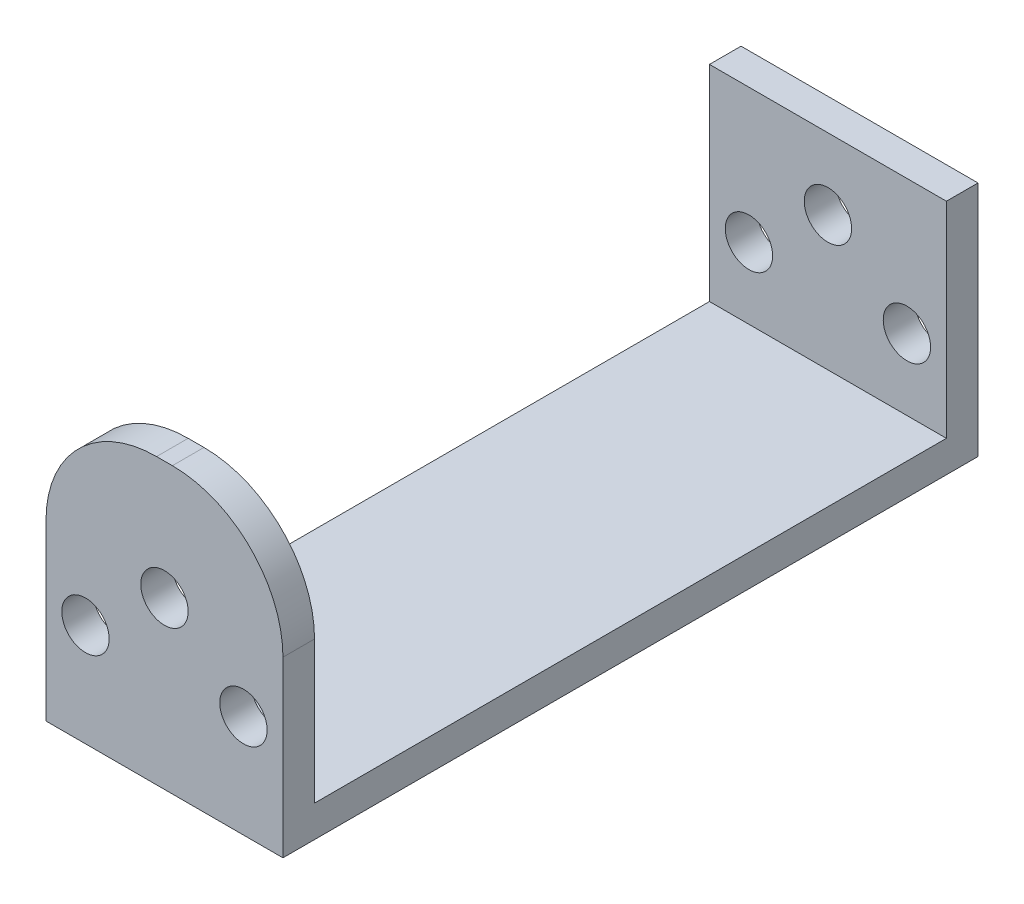
ISO-10303-21;
HEADER;
FILE_DESCRIPTION(('STEP AP214'),'2;1');
FILE_NAME('part.step','',(''),(''),'','','');
FILE_SCHEMA(('AUTOMOTIVE_DESIGN { 1 0 10303 214 1 1 1 1 }'));
ENDSEC;
DATA;
#1=APPLICATION_CONTEXT('core data for automotive mechanical design processes');
#2=APPLICATION_PROTOCOL_DEFINITION('international standard','automotive_design',2000,#1);
#3=PRODUCT_CONTEXT('',#1,'mechanical');
#4=PRODUCT('Part','Part','',(#3));
#5=PRODUCT_RELATED_PRODUCT_CATEGORY('part','',(#4));
#6=PRODUCT_DEFINITION_FORMATION('','',#4);
#7=PRODUCT_DEFINITION_CONTEXT('part definition',#1,'design');
#8=PRODUCT_DEFINITION('design','',#6,#7);
#9=PRODUCT_DEFINITION_SHAPE('','',#8);
#10=(LENGTH_UNIT() NAMED_UNIT(*) SI_UNIT(.MILLI.,.METRE.));
#11=(NAMED_UNIT(*) PLANE_ANGLE_UNIT() SI_UNIT($,.RADIAN.));
#12=(NAMED_UNIT(*) SI_UNIT($,.STERADIAN.) SOLID_ANGLE_UNIT());
#13=UNCERTAINTY_MEASURE_WITH_UNIT(LENGTH_MEASURE(1.E-05),#10,'distance_accuracy_value','');
#14=(GEOMETRIC_REPRESENTATION_CONTEXT(3) GLOBAL_UNCERTAINTY_ASSIGNED_CONTEXT((#13)) GLOBAL_UNIT_ASSIGNED_CONTEXT((#10,
#11,#12)) REPRESENTATION_CONTEXT('',''));
#15=CARTESIAN_POINT('',(0.,0.,0.));
#16=DIRECTION('',(0.,0.,1.));
#17=DIRECTION('',(1.,0.,0.));
#18=AXIS2_PLACEMENT_3D('',#15,#16,#17);
#19=CARTESIAN_POINT('',(7.5,16.,20.));
#20=DIRECTION('',(0.,-1.,0.));
#21=DIRECTION('',(0.,0.,-1.));
#22=AXIS2_PLACEMENT_3D('',#19,#20,#21);
#23=PLANE('',#22);
#24=DIRECTION('',(-1.,0.,0.));
#25=VECTOR('',#24,1.);
#26=CARTESIAN_POINT('',(7.5,16.,22.));
#27=LINE('',#26,#25);
#28=CARTESIAN_POINT('',(0.5,16.,22.));
#29=VERTEX_POINT('',#28);
#30=CARTESIAN_POINT('',(-0.5,16.,22.));
#31=VERTEX_POINT('',#30);
#32=EDGE_CURVE('E129',#29,#31,#27,.T.);
#33=ORIENTED_EDGE('',*,*,#32,.F.);
#34=DIRECTION('',(0.,0.,1.));
#35=VECTOR('',#34,1.);
#36=CARTESIAN_POINT('',(0.5,16.,20.));
#37=LINE('',#36,#35);
#38=CARTESIAN_POINT('',(0.5,16.,20.));
#39=VERTEX_POINT('',#38);
#40=EDGE_CURVE('E198',#29,#39,#37,.F.);
#41=ORIENTED_EDGE('',*,*,#40,.T.);
#42=DIRECTION('',(-1.,0.,0.));
#43=VECTOR('',#42,1.);
#44=CARTESIAN_POINT('',(7.5,16.,20.));
#45=LINE('',#44,#43);
#46=CARTESIAN_POINT('',(-0.5,16.,20.));
#47=VERTEX_POINT('',#46);
#48=EDGE_CURVE('E176',#39,#47,#45,.T.);
#49=ORIENTED_EDGE('',*,*,#48,.T.);
#50=DIRECTION('',(0.,0.,1.));
#51=VECTOR('',#50,1.);
#52=CARTESIAN_POINT('',(-0.5,16.,20.));
#53=LINE('',#52,#51);
#54=EDGE_CURVE('E195',#47,#31,#53,.T.);
#55=ORIENTED_EDGE('',*,*,#54,.T.);
#56=EDGE_LOOP('',(#33,#41,#49,#55));
#57=FACE_BOUND('',#56,.T.);
#58=ADVANCED_FACE('F33',(#57),#23,.F.);
#59=CARTESIAN_POINT('',(7.5,13.,22.));
#60=DIRECTION('',(0.,0.,-1.));
#61=DIRECTION('',(0.,1.,0.));
#62=AXIS2_PLACEMENT_3D('',#59,#60,#61);
#63=PLANE('',#62);
#64=CARTESIAN_POINT('',(0.,8.5,22.));
#65=DIRECTION('',(0.,0.,1.));
#66=DIRECTION('',(1.,0.,0.));
#67=AXIS2_PLACEMENT_3D('',#64,#65,#66);
#68=CIRCLE('',#67,1.5);
#69=CARTESIAN_POINT('',(1.5,8.5,22.));
#70=VERTEX_POINT('',#69);
#71=EDGE_CURVE('E279',#70,#70,#68,.T.);
#72=ORIENTED_EDGE('',*,*,#71,.F.);
#73=EDGE_LOOP('',(#72));
#74=FACE_BOUND('',#73,.T.);
#75=CARTESIAN_POINT('',(5.,4.5,22.));
#76=DIRECTION('',(0.,0.,1.));
#77=DIRECTION('',(1.,0.,0.));
#78=AXIS2_PLACEMENT_3D('',#75,#76,#77);
#79=CIRCLE('',#78,1.5);
#80=CARTESIAN_POINT('',(6.5,4.5,22.));
#81=VERTEX_POINT('',#80);
#82=EDGE_CURVE('E409',#81,#81,#79,.T.);
#83=ORIENTED_EDGE('',*,*,#82,.F.);
#84=EDGE_LOOP('',(#83));
#85=FACE_BOUND('',#84,.T.);
#86=CARTESIAN_POINT('',(-5.,4.5,22.));
#87=DIRECTION('',(0.,0.,1.));
#88=DIRECTION('',(1.,0.,0.));
#89=AXIS2_PLACEMENT_3D('',#86,#87,#88);
#90=CIRCLE('',#89,1.5);
#91=CARTESIAN_POINT('',(-3.5,4.5,22.));
#92=VERTEX_POINT('',#91);
#93=EDGE_CURVE('E410',#92,#92,#90,.T.);
#94=ORIENTED_EDGE('',*,*,#93,.F.);
#95=EDGE_LOOP('',(#94));
#96=FACE_BOUND('',#95,.T.);
#97=DIRECTION('',(0.,-1.,0.));
#98=VECTOR('',#97,1.);
#99=CARTESIAN_POINT('',(7.5,13.,22.));
#100=LINE('',#99,#98);
#101=CARTESIAN_POINT('',(7.5,9.,22.));
#102=VERTEX_POINT('',#101);
#103=CARTESIAN_POINT('',(7.5,-2.,22.));
#104=VERTEX_POINT('',#103);
#105=EDGE_CURVE('E111',#102,#104,#100,.T.);
#106=ORIENTED_EDGE('',*,*,#105,.F.);
#107=CARTESIAN_POINT('',(0.5,9.,22.));
#108=DIRECTION('',(0.,0.,-1.));
#109=DIRECTION('',(0.,1.,0.));
#110=AXIS2_PLACEMENT_3D('',#107,#108,#109);
#111=CIRCLE('',#110,7.);
#112=EDGE_CURVE('E193',#102,#29,#111,.F.);
#113=ORIENTED_EDGE('',*,*,#112,.T.);
#114=ORIENTED_EDGE('',*,*,#32,.T.);
#115=CARTESIAN_POINT('',(-0.5,9.,22.));
#116=DIRECTION('',(0.,0.,-1.));
#117=DIRECTION('',(0.,1.,0.));
#118=AXIS2_PLACEMENT_3D('',#115,#116,#117);
#119=CIRCLE('',#118,7.);
#120=CARTESIAN_POINT('',(-7.5,9.,22.));
#121=VERTEX_POINT('',#120);
#122=EDGE_CURVE('E191',#31,#121,#119,.F.);
#123=ORIENTED_EDGE('',*,*,#122,.T.);
#124=DIRECTION('',(0.,-1.,0.));
#125=VECTOR('',#124,1.);
#126=CARTESIAN_POINT('',(-7.5,13.,22.));
#127=LINE('',#126,#125);
#128=CARTESIAN_POINT('',(-7.5,-2.,22.));
#129=VERTEX_POINT('',#128);
#130=EDGE_CURVE('E126',#121,#129,#127,.T.);
#131=ORIENTED_EDGE('',*,*,#130,.T.);
#132=DIRECTION('',(-1.,0.,0.));
#133=VECTOR('',#132,1.);
#134=CARTESIAN_POINT('',(7.5,-2.,22.));
#135=LINE('',#134,#133);
#136=EDGE_CURVE('E124',#104,#129,#135,.T.);
#137=ORIENTED_EDGE('',*,*,#136,.F.);
#138=EDGE_LOOP('',(#106,#113,#114,#123,#131,#137));
#139=FACE_BOUND('',#138,.T.);
#140=ADVANCED_FACE('F125',(#74,#85,#96,#139),#63,.F.);
#141=CARTESIAN_POINT('',(7.5,-2.,22.));
#142=DIRECTION('',(0.,1.,0.));
#143=DIRECTION('',(0.,0.,1.));
#144=AXIS2_PLACEMENT_3D('',#141,#142,#143);
#145=PLANE('',#144);
#146=DIRECTION('',(0.,0.,-1.));
#147=VECTOR('',#146,1.);
#148=CARTESIAN_POINT('',(-7.5,-2.,22.));
#149=LINE('',#148,#147);
#150=CARTESIAN_POINT('',(-7.5,-2.,-22.));
#151=VERTEX_POINT('',#150);
#152=EDGE_CURVE('E149',#129,#151,#149,.T.);
#153=ORIENTED_EDGE('',*,*,#152,.T.);
#154=DIRECTION('',(-1.,0.,0.));
#155=VECTOR('',#154,1.);
#156=CARTESIAN_POINT('',(7.5,-2.,-22.));
#157=LINE('',#156,#155);
#158=CARTESIAN_POINT('',(7.5,-2.,-22.));
#159=VERTEX_POINT('',#158);
#160=EDGE_CURVE('E130',#159,#151,#157,.T.);
#161=ORIENTED_EDGE('',*,*,#160,.F.);
#162=DIRECTION('',(0.,0.,-1.));
#163=VECTOR('',#162,1.);
#164=CARTESIAN_POINT('',(7.5,-2.,22.));
#165=LINE('',#164,#163);
#166=EDGE_CURVE('E116',#104,#159,#165,.T.);
#167=ORIENTED_EDGE('',*,*,#166,.F.);
#168=ORIENTED_EDGE('',*,*,#136,.T.);
#169=EDGE_LOOP('',(#153,#161,#167,#168));
#170=FACE_BOUND('',#169,.T.);
#171=ADVANCED_FACE('F132',(#170),#145,.F.);
#172=CARTESIAN_POINT('',(7.5,13.,-22.));
#173=DIRECTION('',(0.,0.,1.));
#174=DIRECTION('',(0.,-1.,0.));
#175=AXIS2_PLACEMENT_3D('',#172,#173,#174);
#176=PLANE('',#175);
#177=CARTESIAN_POINT('',(0.,8.5,-22.));
#178=DIRECTION('',(0.,0.,1.));
#179=DIRECTION('',(1.,0.,0.));
#180=AXIS2_PLACEMENT_3D('',#177,#178,#179);
#181=CIRCLE('',#180,1.5);
#182=CARTESIAN_POINT('',(1.5,8.5,-22.));
#183=VERTEX_POINT('',#182);
#184=EDGE_CURVE('E182',#183,#183,#181,.T.);
#185=ORIENTED_EDGE('',*,*,#184,.T.);
#186=EDGE_LOOP('',(#185));
#187=FACE_BOUND('',#186,.T.);
#188=CARTESIAN_POINT('',(5.,4.5,-22.));
#189=DIRECTION('',(0.,0.,1.));
#190=DIRECTION('',(1.,0.,0.));
#191=AXIS2_PLACEMENT_3D('',#188,#189,#190);
#192=CIRCLE('',#191,1.5);
#193=CARTESIAN_POINT('',(6.5,4.5,-22.));
#194=VERTEX_POINT('',#193);
#195=EDGE_CURVE('E405',#194,#194,#192,.T.);
#196=ORIENTED_EDGE('',*,*,#195,.T.);
#197=EDGE_LOOP('',(#196));
#198=FACE_BOUND('',#197,.T.);
#199=CARTESIAN_POINT('',(-5.,4.5,-22.));
#200=DIRECTION('',(0.,0.,1.));
#201=DIRECTION('',(1.,0.,0.));
#202=AXIS2_PLACEMENT_3D('',#199,#200,#201);
#203=CIRCLE('',#202,1.5);
#204=CARTESIAN_POINT('',(-3.5,4.5,-22.));
#205=VERTEX_POINT('',#204);
#206=EDGE_CURVE('E408',#205,#205,#203,.T.);
#207=ORIENTED_EDGE('',*,*,#206,.T.);
#208=EDGE_LOOP('',(#207));
#209=FACE_BOUND('',#208,.T.);
#210=DIRECTION('',(0.,1.,0.));
#211=VECTOR('',#210,1.);
#212=CARTESIAN_POINT('',(-7.5,13.,-22.));
#213=LINE('',#212,#211);
#214=CARTESIAN_POINT('',(-7.5,13.,-22.));
#215=VERTEX_POINT('',#214);
#216=EDGE_CURVE('E152',#151,#215,#213,.T.);
#217=ORIENTED_EDGE('',*,*,#216,.T.);
#218=DIRECTION('',(-1.,0.,0.));
#219=VECTOR('',#218,1.);
#220=CARTESIAN_POINT('',(7.5,13.,-22.));
#221=LINE('',#220,#219);
#222=CARTESIAN_POINT('',(7.5,13.,-22.));
#223=VERTEX_POINT('',#222);
#224=EDGE_CURVE('E170',#223,#215,#221,.T.);
#225=ORIENTED_EDGE('',*,*,#224,.F.);
#226=DIRECTION('',(0.,1.,0.));
#227=VECTOR('',#226,1.);
#228=CARTESIAN_POINT('',(7.5,13.,-22.));
#229=LINE('',#228,#227);
#230=EDGE_CURVE('E135',#159,#223,#229,.T.);
#231=ORIENTED_EDGE('',*,*,#230,.F.);
#232=ORIENTED_EDGE('',*,*,#160,.T.);
#233=EDGE_LOOP('',(#217,#225,#231,#232));
#234=FACE_BOUND('',#233,.T.);
#235=ADVANCED_FACE('F215',(#187,#198,#209,#234),#176,.F.);
#236=CARTESIAN_POINT('',(7.5,13.,-20.));
#237=DIRECTION('',(0.,-1.,0.));
#238=DIRECTION('',(0.,0.,-1.));
#239=AXIS2_PLACEMENT_3D('',#236,#237,#238);
#240=PLANE('',#239);
#241=DIRECTION('',(0.,0.,1.));
#242=VECTOR('',#241,1.);
#243=CARTESIAN_POINT('',(-7.5,13.,-20.));
#244=LINE('',#243,#242);
#245=CARTESIAN_POINT('',(-7.5,13.,-20.));
#246=VERTEX_POINT('',#245);
#247=EDGE_CURVE('E154',#215,#246,#244,.T.);
#248=ORIENTED_EDGE('',*,*,#247,.T.);
#249=DIRECTION('',(-1.,0.,0.));
#250=VECTOR('',#249,1.);
#251=CARTESIAN_POINT('',(7.5,13.,-20.));
#252=LINE('',#251,#250);
#253=CARTESIAN_POINT('',(7.5,13.,-20.));
#254=VERTEX_POINT('',#253);
#255=EDGE_CURVE('E167',#254,#246,#252,.T.);
#256=ORIENTED_EDGE('',*,*,#255,.F.);
#257=DIRECTION('',(0.,0.,1.));
#258=VECTOR('',#257,1.);
#259=CARTESIAN_POINT('',(7.5,13.,-20.));
#260=LINE('',#259,#258);
#261=EDGE_CURVE('E137',#223,#254,#260,.T.);
#262=ORIENTED_EDGE('',*,*,#261,.F.);
#263=ORIENTED_EDGE('',*,*,#224,.T.);
#264=EDGE_LOOP('',(#248,#256,#262,#263));
#265=FACE_BOUND('',#264,.T.);
#266=ADVANCED_FACE('F222',(#265),#240,.F.);
#267=CARTESIAN_POINT('',(7.5,13.,-20.));
#268=DIRECTION('',(0.,0.,-1.));
#269=DIRECTION('',(0.,1.,0.));
#270=AXIS2_PLACEMENT_3D('',#267,#268,#269);
#271=PLANE('',#270);
#272=CARTESIAN_POINT('',(0.,8.5,-20.));
#273=DIRECTION('',(0.,0.,-1.));
#274=DIRECTION('',(0.,1.,0.));
#275=AXIS2_PLACEMENT_3D('',#272,#273,#274);
#276=CIRCLE('',#275,1.5);
#277=CARTESIAN_POINT('',(0.,10.,-20.));
#278=VERTEX_POINT('',#277);
#279=EDGE_CURVE('E150',#278,#278,#276,.T.);
#280=ORIENTED_EDGE('',*,*,#279,.T.);
#281=EDGE_LOOP('',(#280));
#282=FACE_BOUND('',#281,.T.);
#283=CARTESIAN_POINT('',(5.,4.5,-20.));
#284=DIRECTION('',(0.,0.,-1.));
#285=DIRECTION('',(0.,1.,0.));
#286=AXIS2_PLACEMENT_3D('',#283,#284,#285);
#287=CIRCLE('',#286,1.5);
#288=CARTESIAN_POINT('',(5.,6.,-20.));
#289=VERTEX_POINT('',#288);
#290=EDGE_CURVE('E186',#289,#289,#287,.T.);
#291=ORIENTED_EDGE('',*,*,#290,.T.);
#292=EDGE_LOOP('',(#291));
#293=FACE_BOUND('',#292,.T.);
#294=CARTESIAN_POINT('',(-5.,4.5,-20.));
#295=DIRECTION('',(0.,0.,-1.));
#296=DIRECTION('',(0.,1.,0.));
#297=AXIS2_PLACEMENT_3D('',#294,#295,#296);
#298=CIRCLE('',#297,1.5);
#299=CARTESIAN_POINT('',(-5.,6.,-20.));
#300=VERTEX_POINT('',#299);
#301=EDGE_CURVE('E181',#300,#300,#298,.T.);
#302=ORIENTED_EDGE('',*,*,#301,.T.);
#303=EDGE_LOOP('',(#302));
#304=FACE_BOUND('',#303,.T.);
#305=DIRECTION('',(0.,-1.,0.));
#306=VECTOR('',#305,1.);
#307=CARTESIAN_POINT('',(-7.5,13.,-20.));
#308=LINE('',#307,#306);
#309=CARTESIAN_POINT('',(-7.5,0.,-20.));
#310=VERTEX_POINT('',#309);
#311=EDGE_CURVE('E156',#246,#310,#308,.T.);
#312=ORIENTED_EDGE('',*,*,#311,.T.);
#313=DIRECTION('',(-1.,0.,0.));
#314=VECTOR('',#313,1.);
#315=CARTESIAN_POINT('',(7.5,0.,-20.));
#316=LINE('',#315,#314);
#317=CARTESIAN_POINT('',(7.5,0.,-20.));
#318=VERTEX_POINT('',#317);
#319=EDGE_CURVE('E164',#318,#310,#316,.T.);
#320=ORIENTED_EDGE('',*,*,#319,.F.);
#321=DIRECTION('',(0.,-1.,0.));
#322=VECTOR('',#321,1.);
#323=CARTESIAN_POINT('',(7.5,13.,-20.));
#324=LINE('',#323,#322);
#325=EDGE_CURVE('E142',#254,#318,#324,.T.);
#326=ORIENTED_EDGE('',*,*,#325,.F.);
#327=ORIENTED_EDGE('',*,*,#255,.T.);
#328=EDGE_LOOP('',(#312,#320,#326,#327));
#329=FACE_BOUND('',#328,.T.);
#330=ADVANCED_FACE('F225',(#282,#293,#304,#329),#271,.F.);
#331=CARTESIAN_POINT('',(7.5,0.,20.));
#332=DIRECTION('',(0.,-1.,0.));
#333=DIRECTION('',(0.,0.,-1.));
#334=AXIS2_PLACEMENT_3D('',#331,#332,#333);
#335=PLANE('',#334);
#336=DIRECTION('',(0.,0.,1.));
#337=VECTOR('',#336,1.);
#338=CARTESIAN_POINT('',(-7.5,0.,20.));
#339=LINE('',#338,#337);
#340=CARTESIAN_POINT('',(-7.5,0.,20.));
#341=VERTEX_POINT('',#340);
#342=EDGE_CURVE('E158',#310,#341,#339,.T.);
#343=ORIENTED_EDGE('',*,*,#342,.T.);
#344=DIRECTION('',(-1.,0.,0.));
#345=VECTOR('',#344,1.);
#346=CARTESIAN_POINT('',(7.5,0.,20.));
#347=LINE('',#346,#345);
#348=CARTESIAN_POINT('',(7.5,0.,20.));
#349=VERTEX_POINT('',#348);
#350=EDGE_CURVE('E147',#349,#341,#347,.T.);
#351=ORIENTED_EDGE('',*,*,#350,.F.);
#352=DIRECTION('',(0.,0.,1.));
#353=VECTOR('',#352,1.);
#354=CARTESIAN_POINT('',(7.5,0.,20.));
#355=LINE('',#354,#353);
#356=EDGE_CURVE('E144',#318,#349,#355,.T.);
#357=ORIENTED_EDGE('',*,*,#356,.F.);
#358=ORIENTED_EDGE('',*,*,#319,.T.);
#359=EDGE_LOOP('',(#343,#351,#357,#358));
#360=FACE_BOUND('',#359,.T.);
#361=ADVANCED_FACE('F228',(#360),#335,.F.);
#362=CARTESIAN_POINT('',(7.5,13.,20.));
#363=DIRECTION('',(0.,0.,1.));
#364=DIRECTION('',(1.,0.,0.));
#365=AXIS2_PLACEMENT_3D('',#362,#363,#364);
#366=PLANE('',#365);
#367=CARTESIAN_POINT('',(0.,8.5,20.));
#368=DIRECTION('',(0.,0.,1.));
#369=DIRECTION('',(1.,0.,0.));
#370=AXIS2_PLACEMENT_3D('',#367,#368,#369);
#371=CIRCLE('',#370,1.5);
#372=CARTESIAN_POINT('',(1.5,8.5,20.));
#373=VERTEX_POINT('',#372);
#374=EDGE_CURVE('E187',#373,#373,#371,.T.);
#375=ORIENTED_EDGE('',*,*,#374,.T.);
#376=EDGE_LOOP('',(#375));
#377=FACE_BOUND('',#376,.T.);
#378=CARTESIAN_POINT('',(5.,4.5,20.));
#379=DIRECTION('',(0.,0.,1.));
#380=DIRECTION('',(1.,0.,0.));
#381=AXIS2_PLACEMENT_3D('',#378,#379,#380);
#382=CIRCLE('',#381,1.5);
#383=CARTESIAN_POINT('',(6.5,4.5,20.));
#384=VERTEX_POINT('',#383);
#385=EDGE_CURVE('E183',#384,#384,#382,.T.);
#386=ORIENTED_EDGE('',*,*,#385,.T.);
#387=EDGE_LOOP('',(#386));
#388=FACE_BOUND('',#387,.T.);
#389=CARTESIAN_POINT('',(-5.,4.5,20.));
#390=DIRECTION('',(0.,0.,1.));
#391=DIRECTION('',(1.,0.,0.));
#392=AXIS2_PLACEMENT_3D('',#389,#390,#391);
#393=CIRCLE('',#392,1.5);
#394=CARTESIAN_POINT('',(-3.5,4.5,20.));
#395=VERTEX_POINT('',#394);
#396=EDGE_CURVE('E178',#395,#395,#393,.T.);
#397=ORIENTED_EDGE('',*,*,#396,.T.);
#398=EDGE_LOOP('',(#397));
#399=FACE_BOUND('',#398,.T.);
#400=ORIENTED_EDGE('',*,*,#48,.F.);
#401=CARTESIAN_POINT('',(0.5,9.,20.));
#402=DIRECTION('',(0.,0.,1.));
#403=DIRECTION('',(1.,0.,0.));
#404=AXIS2_PLACEMENT_3D('',#401,#402,#403);
#405=CIRCLE('',#404,7.);
#406=CARTESIAN_POINT('',(7.5,9.,20.));
#407=VERTEX_POINT('',#406);
#408=EDGE_CURVE('E41',#39,#407,#405,.F.);
#409=ORIENTED_EDGE('',*,*,#408,.T.);
#410=DIRECTION('',(0.,1.,0.));
#411=VECTOR('',#410,1.);
#412=CARTESIAN_POINT('',(7.5,13.,20.));
#413=LINE('',#412,#411);
#414=EDGE_CURVE('E121',#349,#407,#413,.T.);
#415=ORIENTED_EDGE('',*,*,#414,.F.);
#416=ORIENTED_EDGE('',*,*,#350,.T.);
#417=DIRECTION('',(0.,1.,0.));
#418=VECTOR('',#417,1.);
#419=CARTESIAN_POINT('',(-7.5,13.,20.));
#420=LINE('',#419,#418);
#421=CARTESIAN_POINT('',(-7.5,9.,20.));
#422=VERTEX_POINT('',#421);
#423=EDGE_CURVE('E160',#341,#422,#420,.T.);
#424=ORIENTED_EDGE('',*,*,#423,.T.);
#425=CARTESIAN_POINT('',(-0.5,9.,20.));
#426=DIRECTION('',(0.,0.,1.));
#427=DIRECTION('',(1.,0.,0.));
#428=AXIS2_PLACEMENT_3D('',#425,#426,#427);
#429=CIRCLE('',#428,7.);
#430=EDGE_CURVE('E53',#422,#47,#429,.F.);
#431=ORIENTED_EDGE('',*,*,#430,.T.);
#432=EDGE_LOOP('',(#400,#409,#415,#416,#424,#431));
#433=FACE_BOUND('',#432,.T.);
#434=ADVANCED_FACE('F201',(#377,#388,#399,#433),#366,.F.);
#435=CARTESIAN_POINT('',(7.5,0.,0.));
#436=DIRECTION('',(1.,0.,0.));
#437=DIRECTION('',(0.,0.,-1.));
#438=AXIS2_PLACEMENT_3D('',#435,#436,#437);
#439=PLANE('',#438);
#440=ORIENTED_EDGE('',*,*,#414,.T.);
#441=DIRECTION('',(0.,0.,1.));
#442=VECTOR('',#441,1.);
#443=CARTESIAN_POINT('',(7.5,9.,22.));
#444=LINE('',#443,#442);
#445=EDGE_CURVE('E119',#407,#102,#444,.T.);
#446=ORIENTED_EDGE('',*,*,#445,.T.);
#447=ORIENTED_EDGE('',*,*,#105,.T.);
#448=ORIENTED_EDGE('',*,*,#166,.T.);
#449=ORIENTED_EDGE('',*,*,#230,.T.);
#450=ORIENTED_EDGE('',*,*,#261,.T.);
#451=ORIENTED_EDGE('',*,*,#325,.T.);
#452=ORIENTED_EDGE('',*,*,#356,.T.);
#453=EDGE_LOOP('',(#440,#446,#447,#448,#449,#450,#451,#452));
#454=FACE_BOUND('',#453,.T.);
#455=ADVANCED_FACE('F114',(#454),#439,.T.);
#456=CARTESIAN_POINT('',(-7.5,0.,0.));
#457=DIRECTION('',(1.,0.,0.));
#458=DIRECTION('',(0.,0.,-1.));
#459=AXIS2_PLACEMENT_3D('',#456,#457,#458);
#460=PLANE('',#459);
#461=ORIENTED_EDGE('',*,*,#130,.F.);
#462=DIRECTION('',(0.,0.,1.));
#463=VECTOR('',#462,1.);
#464=CARTESIAN_POINT('',(-7.5,9.,0.));
#465=LINE('',#464,#463);
#466=EDGE_CURVE('E11',#121,#422,#465,.F.);
#467=ORIENTED_EDGE('',*,*,#466,.T.);
#468=ORIENTED_EDGE('',*,*,#423,.F.);
#469=ORIENTED_EDGE('',*,*,#342,.F.);
#470=ORIENTED_EDGE('',*,*,#311,.F.);
#471=ORIENTED_EDGE('',*,*,#247,.F.);
#472=ORIENTED_EDGE('',*,*,#216,.F.);
#473=ORIENTED_EDGE('',*,*,#152,.F.);
#474=EDGE_LOOP('',(#461,#467,#468,#469,#470,#471,#472,#473));
#475=FACE_BOUND('',#474,.T.);
#476=ADVANCED_FACE('F211',(#475),#460,.F.);
#477=CARTESIAN_POINT('',(-5.,4.5,-22.));
#478=DIRECTION('',(0.,0.,1.));
#479=DIRECTION('',(1.,0.,0.));
#480=AXIS2_PLACEMENT_3D('',#477,#478,#479);
#481=CYLINDRICAL_SURFACE('',#480,1.5);
#482=ORIENTED_EDGE('',*,*,#93,.T.);
#483=EDGE_LOOP('',(#482));
#484=FACE_BOUND('',#483,.T.);
#485=ORIENTED_EDGE('',*,*,#396,.F.);
#486=EDGE_LOOP('',(#485));
#487=FACE_BOUND('',#486,.T.);
#488=ADVANCED_FACE('F274',(#484,#487),#481,.F.);
#489=CARTESIAN_POINT('',(5.,4.5,-22.));
#490=DIRECTION('',(0.,0.,1.));
#491=DIRECTION('',(1.,0.,0.));
#492=AXIS2_PLACEMENT_3D('',#489,#490,#491);
#493=CYLINDRICAL_SURFACE('',#492,1.5);
#494=ORIENTED_EDGE('',*,*,#82,.T.);
#495=EDGE_LOOP('',(#494));
#496=FACE_BOUND('',#495,.T.);
#497=ORIENTED_EDGE('',*,*,#385,.F.);
#498=EDGE_LOOP('',(#497));
#499=FACE_BOUND('',#498,.T.);
#500=ADVANCED_FACE('F263',(#496,#499),#493,.F.);
#501=CARTESIAN_POINT('',(0.,8.5,-22.));
#502=DIRECTION('',(0.,0.,1.));
#503=DIRECTION('',(1.,0.,0.));
#504=AXIS2_PLACEMENT_3D('',#501,#502,#503);
#505=CYLINDRICAL_SURFACE('',#504,1.5);
#506=ORIENTED_EDGE('',*,*,#71,.T.);
#507=EDGE_LOOP('',(#506));
#508=FACE_BOUND('',#507,.T.);
#509=ORIENTED_EDGE('',*,*,#374,.F.);
#510=EDGE_LOOP('',(#509));
#511=FACE_BOUND('',#510,.T.);
#512=ADVANCED_FACE('F256',(#508,#511),#505,.F.);
#513=ORIENTED_EDGE('',*,*,#206,.F.);
#514=EDGE_LOOP('',(#513));
#515=FACE_BOUND('',#514,.T.);
#516=ORIENTED_EDGE('',*,*,#301,.F.);
#517=EDGE_LOOP('',(#516));
#518=FACE_BOUND('',#517,.T.);
#519=ADVANCED_FACE('F260',(#515,#518),#481,.F.);
#520=ORIENTED_EDGE('',*,*,#195,.F.);
#521=EDGE_LOOP('',(#520));
#522=FACE_BOUND('',#521,.T.);
#523=ORIENTED_EDGE('',*,*,#290,.F.);
#524=EDGE_LOOP('',(#523));
#525=FACE_BOUND('',#524,.T.);
#526=ADVANCED_FACE('F253',(#522,#525),#493,.F.);
#527=ORIENTED_EDGE('',*,*,#184,.F.);
#528=EDGE_LOOP('',(#527));
#529=FACE_BOUND('',#528,.T.);
#530=ORIENTED_EDGE('',*,*,#279,.F.);
#531=EDGE_LOOP('',(#530));
#532=FACE_BOUND('',#531,.T.);
#533=ADVANCED_FACE('F248',(#529,#532),#505,.F.);
#534=CARTESIAN_POINT('',(0.5,9.,0.));
#535=DIRECTION('',(0.,0.,-1.));
#536=DIRECTION('',(-1.,0.,0.));
#537=AXIS2_PLACEMENT_3D('',#534,#535,#536);
#538=CYLINDRICAL_SURFACE('',#537,7.);
#539=ORIENTED_EDGE('',*,*,#408,.F.);
#540=ORIENTED_EDGE('',*,*,#40,.F.);
#541=ORIENTED_EDGE('',*,*,#112,.F.);
#542=ORIENTED_EDGE('',*,*,#445,.F.);
#543=EDGE_LOOP('',(#539,#540,#541,#542));
#544=FACE_BOUND('',#543,.T.);
#545=ADVANCED_FACE('F206',(#544),#538,.T.);
#546=CARTESIAN_POINT('',(-0.5,9.,20.));
#547=DIRECTION('',(0.,0.,1.));
#548=DIRECTION('',(1.,0.,0.));
#549=AXIS2_PLACEMENT_3D('',#546,#547,#548);
#550=CYLINDRICAL_SURFACE('',#549,7.);
#551=ORIENTED_EDGE('',*,*,#430,.F.);
#552=ORIENTED_EDGE('',*,*,#466,.F.);
#553=ORIENTED_EDGE('',*,*,#122,.F.);
#554=ORIENTED_EDGE('',*,*,#54,.F.);
#555=EDGE_LOOP('',(#551,#552,#553,#554));
#556=FACE_BOUND('',#555,.T.);
#557=ADVANCED_FACE('F35',(#556),#550,.T.);
#558=CLOSED_SHELL('',(#58,#140,#171,#235,#266,#330,#361,#434,#455,#476,#488,#500,#512,#519,#526,
#533,#545,#557));
#559=MANIFOLD_SOLID_BREP('B2',#558);
#560=ADVANCED_BREP_SHAPE_REPRESENTATION('',(#18,#559),#14);
#561=SHAPE_DEFINITION_REPRESENTATION(#9,#560);
ENDSEC;
END-ISO-10303-21;
